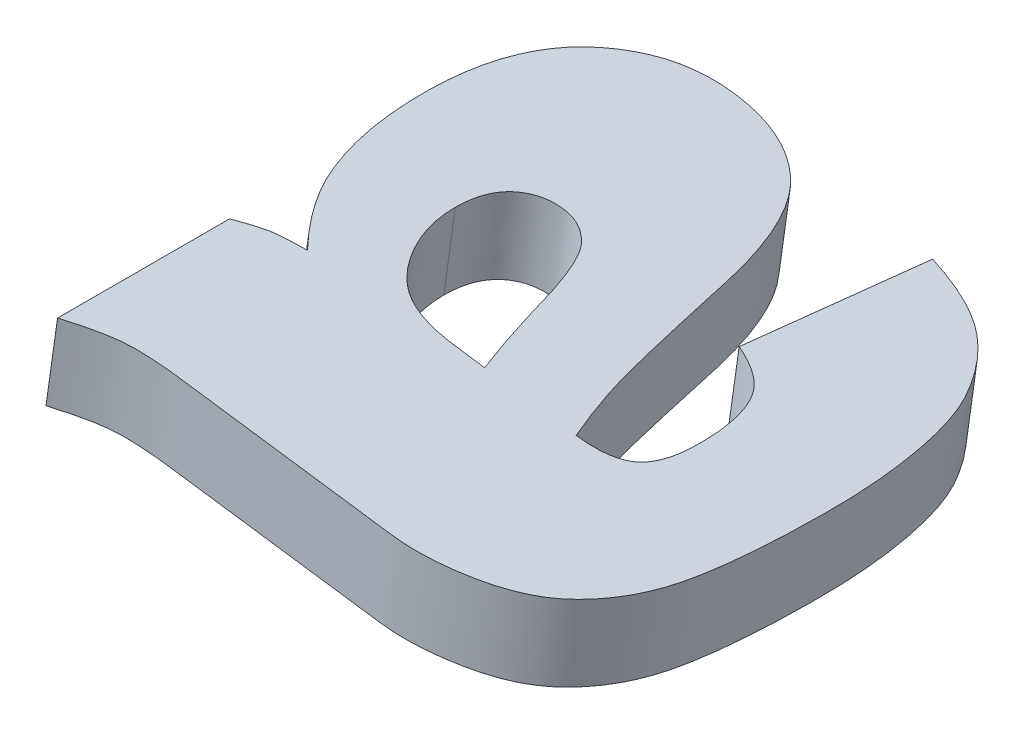
ISO-10303-21;
HEADER;
FILE_DESCRIPTION(('STEP AP214'),'2;1');
FILE_NAME('part.step','',(''),(''),'','','');
FILE_SCHEMA(('AUTOMOTIVE_DESIGN { 1 0 10303 214 1 1 1 1 }'));
ENDSEC;
DATA;
#1=APPLICATION_CONTEXT('core data for automotive mechanical design processes');
#2=APPLICATION_PROTOCOL_DEFINITION('international standard','automotive_design',2000,#1);
#3=PRODUCT_CONTEXT('',#1,'mechanical');
#4=PRODUCT('Part','Part','',(#3));
#5=PRODUCT_RELATED_PRODUCT_CATEGORY('part','',(#4));
#6=PRODUCT_DEFINITION_FORMATION('','',#4);
#7=PRODUCT_DEFINITION_CONTEXT('part definition',#1,'design');
#8=PRODUCT_DEFINITION('design','',#6,#7);
#9=PRODUCT_DEFINITION_SHAPE('','',#8);
#10=(LENGTH_UNIT() NAMED_UNIT(*) SI_UNIT(.MILLI.,.METRE.));
#11=(NAMED_UNIT(*) PLANE_ANGLE_UNIT() SI_UNIT($,.RADIAN.));
#12=(NAMED_UNIT(*) SI_UNIT($,.STERADIAN.) SOLID_ANGLE_UNIT());
#13=UNCERTAINTY_MEASURE_WITH_UNIT(LENGTH_MEASURE(1.E-05),#10,'distance_accuracy_value','');
#14=(GEOMETRIC_REPRESENTATION_CONTEXT(3) GLOBAL_UNCERTAINTY_ASSIGNED_CONTEXT((#13)) GLOBAL_UNIT_ASSIGNED_CONTEXT((#10,
#11,#12)) REPRESENTATION_CONTEXT('',''));
#15=CARTESIAN_POINT('',(0.,0.,0.));
#16=DIRECTION('',(0.,0.,1.));
#17=DIRECTION('',(1.,0.,0.));
#18=AXIS2_PLACEMENT_3D('',#15,#16,#17);
#19=CARTESIAN_POINT('',(815.430242035613,621.354833018957,1984.05582164703));
#20=CARTESIAN_POINT('',(815.430635431243,621.357632174306,1987.76659819662));
#21=CARTESIAN_POINT('',(817.214266978701,621.109414768777,1990.95895743414));
#22=CARTESIAN_POINT('',(818.99789852616,620.861197363247,1994.15131667166));
#23=CARTESIAN_POINT('',(821.564901561165,620.501457053226,1995.48828763438));
#24=CARTESIAN_POINT('',(824.131904596171,620.141716743205,1996.82525859711));
#25=CARTESIAN_POINT('',(828.23888267117,619.56451861644,1996.82525859711));
#26=CARTESIAN_POINT('',(829.995156190084,619.317690470126,1996.82525859711));
#27=CARTESIAN_POINT('',(831.751429708998,619.070862323812,1996.82525859711));
#28=B_SPLINE_CURVE_WITH_KNOTS('',2,(#19,#20,#21,#22,#23,#24,#25,#26,#27),.UNSPECIFIED.,.F.,.F.,
(3,2,2,2,3),(5.,6.,7.,8.,9.),.UNSPECIFIED.);
#29=DIRECTION('',(-0.139173060582166,-0.990267781437723,0.000761744447259926));
#30=VECTOR('',#29,1.);
#31=SURFACE_OF_LINEAR_EXTRUSION('',#28,#30);
#32=CARTESIAN_POINT('',(814.038511429792,611.45215520458,1984.0634390915));
#33=CARTESIAN_POINT('',(814.038904825421,611.454954359929,1987.77421564109));
#34=CARTESIAN_POINT('',(815.822536372879,611.2067369544,1990.96657487861));
#35=CARTESIAN_POINT('',(817.606167920338,610.95851954887,1994.15893411614));
#36=CARTESIAN_POINT('',(820.173170955344,610.598779238849,1995.49590507886));
#37=CARTESIAN_POINT('',(822.740173990349,610.239038928828,1996.83287604158));
#38=CARTESIAN_POINT('',(826.847152065348,609.661840802063,1996.83287604158));
#39=CARTESIAN_POINT('',(828.603425584262,609.415012655749,1996.83287604158));
#40=CARTESIAN_POINT('',(830.359699103177,609.168184509435,1996.83287604158));
#41=B_SPLINE_CURVE_WITH_KNOTS('',2,(#32,#33,#34,#35,#36,#37,#38,#39,#40),.UNSPECIFIED.,.F.,.F.,
(3,2,2,2,3),(5.,6.,7.,8.,9.),.UNSPECIFIED.);
#42=CARTESIAN_POINT('',(814.038511429792,611.45215520458,1984.0634390915));
#43=VERTEX_POINT('',#42);
#44=CARTESIAN_POINT('',(830.359699103177,609.168184509435,1996.83287604158));
#45=VERTEX_POINT('',#44);
#46=EDGE_CURVE('E115',#43,#45,#41,.T.);
#47=ORIENTED_EDGE('',*,*,#46,.F.);
#48=DIRECTION('',(-0.139173060582166,-0.990267781437723,0.000761744447259926));
#49=VECTOR('',#48,1.);
#50=CARTESIAN_POINT('',(815.430242035613,621.354833018957,1984.05582164703));
#51=LINE('',#50,#49);
#52=CARTESIAN_POINT('',(815.430242035613,621.354833018957,1984.05582164703));
#53=VERTEX_POINT('',#52);
#54=EDGE_CURVE('E27',#53,#43,#51,.T.);
#55=ORIENTED_EDGE('',*,*,#54,.F.);
#56=CARTESIAN_POINT('',(831.751429708998,619.070862323812,1996.82525859711));
#57=VERTEX_POINT('',#56);
#58=EDGE_CURVE('E104',#53,#57,#28,.T.);
#59=ORIENTED_EDGE('',*,*,#58,.T.);
#60=DIRECTION('',(-0.139173060582166,-0.990267781437723,0.000761744447259926));
#61=VECTOR('',#60,1.);
#62=CARTESIAN_POINT('',(831.751429708998,619.070862323812,1996.82525859711));
#63=LINE('',#62,#61);
#64=EDGE_CURVE('E11',#57,#45,#63,.T.);
#65=ORIENTED_EDGE('',*,*,#64,.T.);
#66=EDGE_LOOP('',(#47,#55,#59,#65));
#67=FACE_BOUND('',#66,.T.);
#68=ADVANCED_FACE('F17',(#67),#31,.T.);
#69=CARTESIAN_POINT('',(843.313773155098,617.431063004849,1977.56196268523));
#70=DIRECTION('',(-0.984824225523739,0.13832738958797,-0.104817832983448));
#71=DIRECTION('',(-0.103692352802707,0.0153380030052165,0.994491147086816));
#72=AXIS2_PLACEMENT_3D('',#69,#70,#71);
#73=PLANE('',#72);
#74=CARTESIAN_POINT('',(841.922042549277,607.528385190472,1977.56958012971));
#75=CARTESIAN_POINT('',(843.028720618618,607.364687182909,1966.95566779299));
#76=CARTESIAN_POINT('',(844.13539868796,607.200989175345,1956.34175545629));
#77=B_SPLINE_CURVE_WITH_KNOTS('',2,(#74,#75,#76),.UNSPECIFIED.,.F.,.F.,(3,3),(0.,1.),.UNSPECIFIED.);
#78=CARTESIAN_POINT('',(841.922042549277,607.528385190472,1977.56958012971));
#79=VERTEX_POINT('',#78);
#80=CARTESIAN_POINT('',(844.13539868796,607.200989175345,1956.34175545629));
#81=VERTEX_POINT('',#80);
#82=EDGE_CURVE('E91',#79,#81,#77,.T.);
#83=ORIENTED_EDGE('',*,*,#82,.F.);
#84=DIRECTION('',(-0.139173060582166,-0.990267781437723,0.000761744447259926));
#85=VECTOR('',#84,1.);
#86=CARTESIAN_POINT('',(843.313773155098,617.431063004849,1977.56196268523));
#87=LINE('',#86,#85);
#88=CARTESIAN_POINT('',(843.313773155098,617.431063004849,1977.56196268523));
#89=VERTEX_POINT('',#88);
#90=EDGE_CURVE('E86',#89,#79,#87,.T.);
#91=ORIENTED_EDGE('',*,*,#90,.F.);
#92=CARTESIAN_POINT('',(843.313773155098,617.431063004849,1977.56196268523));
#93=CARTESIAN_POINT('',(844.42045122444,617.267364997286,1966.94805034853));
#94=CARTESIAN_POINT('',(845.527129293781,617.103666989723,1956.33413801181));
#95=B_SPLINE_CURVE_WITH_KNOTS('',2,(#92,#93,#94),.UNSPECIFIED.,.F.,.F.,(3,3),(0.,1.),.UNSPECIFIED.);
#96=CARTESIAN_POINT('',(845.527129293781,617.103666989723,1956.33413801181));
#97=VERTEX_POINT('',#96);
#98=EDGE_CURVE('E89',#89,#97,#95,.T.);
#99=ORIENTED_EDGE('',*,*,#98,.T.);
#100=DIRECTION('',(-0.139173060582166,-0.990267781437723,0.000761744447259926));
#101=VECTOR('',#100,1.);
#102=CARTESIAN_POINT('',(845.527129293781,617.103666989723,1956.33413801181));
#103=LINE('',#102,#101);
#104=EDGE_CURVE('E21',#97,#81,#103,.T.);
#105=ORIENTED_EDGE('',*,*,#104,.T.);
#106=EDGE_LOOP('',(#83,#91,#99,#105));
#107=FACE_BOUND('',#106,.T.);
#108=ADVANCED_FACE('F19',(#107),#73,.T.);
#109=CARTESIAN_POINT('',(845.527129293781,617.103666989723,1956.33413801181));
#110=CARTESIAN_POINT('',(851.039253458968,616.32991195499,1957.53468336609));
#111=CARTESIAN_POINT('',(854.200785880052,615.887329599669,1959.79934846621));
#112=CARTESIAN_POINT('',(857.362318301136,615.444747244348,1962.06401356634));
#113=CARTESIAN_POINT('',(859.689544655393,615.120949798914,1966.31876918079));
#114=CARTESIAN_POINT('',(861.361993226539,614.888254524573,1969.37642617877));
#115=CARTESIAN_POINT('',(862.281226327419,614.763178494097,1974.72431002967));
#116=CARTESIAN_POINT('',(863.200459428298,614.638102463622,1980.07219388055));
#117=CARTESIAN_POINT('',(863.201118944501,614.642795165238,1986.29320162546));
#118=CARTESIAN_POINT('',(863.202177641562,614.650328186252,1996.27955616334));
#119=CARTESIAN_POINT('',(862.095016505528,614.810588995702,2002.33685317813));
#120=CARTESIAN_POINT('',(860.987855369495,614.970849805152,2008.3941501929));
#121=CARTESIAN_POINT('',(857.487906823487,615.465850053963,2012.44307655344));
#122=CARTESIAN_POINT('',(855.044273936746,615.811454816729,2015.27000085834));
#123=CARTESIAN_POINT('',(850.586214714859,616.439253494235,2016.90710815963));
#124=CARTESIAN_POINT('',(846.128155492972,617.06705217174,2018.54421546092));
#125=CARTESIAN_POINT('',(842.075216603171,617.636655586311,2018.54421546092));
#126=CARTESIAN_POINT('',(829.40302767439,619.417615595868,2018.54421546092));
#127=CARTESIAN_POINT('',(816.73083874561,621.198575605426,2018.54421546092));
#128=CARTESIAN_POINT('',(812.677899855808,621.768179019997,2018.54421546092));
#129=CARTESIAN_POINT('',(810.381289444604,622.091345346721,2019.06263277299));
#130=CARTESIAN_POINT('',(808.0846790334,622.414511673446,2019.58105008507));
#131=CARTESIAN_POINT('',(804.518277937729,622.917079927844,2021.32729787311));
#132=B_SPLINE_CURVE_WITH_KNOTS('',2,(#109,#110,#111,#112,#113,#114,#115,#116,#117,#118,#119,
#120,#121,#122,#123,#124,#125,#126,#127,#128,#129,#130,#131),.UNSPECIFIED.,.F.,.F.,(3,2,2,2,2,2,
2,2,2,2,2,3),(1.,2.,3.,4.,5.,6.,7.,8.,9.,10.,11.,12.),.UNSPECIFIED.);
#133=DIRECTION('',(-0.139173060582166,-0.990267781437723,0.000761744447259926));
#134=VECTOR('',#133,1.);
#135=SURFACE_OF_LINEAR_EXTRUSION('',#132,#134);
#136=CARTESIAN_POINT('',(844.13539868796,607.200989175345,1956.34175545629));
#137=CARTESIAN_POINT('',(849.647522853146,606.427234140613,1957.54230081057));
#138=CARTESIAN_POINT('',(852.80905527423,605.984651785292,1959.80696591069));
#139=CARTESIAN_POINT('',(855.970587695314,605.542069429971,1962.07163101081));
#140=CARTESIAN_POINT('',(858.297814049571,605.218271984537,1966.32638662527));
#141=CARTESIAN_POINT('',(859.970262620717,604.985576710196,1969.38404362325));
#142=CARTESIAN_POINT('',(860.889495721597,604.86050067972,1974.73192747414));
#143=CARTESIAN_POINT('',(861.808728822477,604.735424649245,1980.07981132502));
#144=CARTESIAN_POINT('',(861.809388338679,604.74011735086,1986.30081906993));
#145=CARTESIAN_POINT('',(861.81044703574,604.747650371875,1996.28717360782));
#146=CARTESIAN_POINT('',(860.703285899707,604.907911181325,2002.3444706226));
#147=CARTESIAN_POINT('',(859.596124763673,605.068171990775,2008.40176763738));
#148=CARTESIAN_POINT('',(856.096176217666,605.563172239585,2012.45069399791));
#149=CARTESIAN_POINT('',(853.652543330924,605.908777002352,2015.2776183028));
#150=CARTESIAN_POINT('',(849.194484109037,606.536575679858,2016.9147256041));
#151=CARTESIAN_POINT('',(844.736424887151,607.164374357363,2018.55183290539));
#152=CARTESIAN_POINT('',(840.683485997349,607.733977771934,2018.55183290539));
#153=CARTESIAN_POINT('',(828.011297068569,609.514937781491,2018.55183290539));
#154=CARTESIAN_POINT('',(815.339108139789,611.295897791049,2018.55183290539));
#155=CARTESIAN_POINT('',(811.286169249987,611.865501205619,2018.55183290539));
#156=CARTESIAN_POINT('',(808.989558838783,612.188667532344,2019.07025021747));
#157=CARTESIAN_POINT('',(806.692948427578,612.511833859069,2019.58866752954));
#158=CARTESIAN_POINT('',(803.126547331908,613.014402113467,2021.33491531759));
#159=B_SPLINE_CURVE_WITH_KNOTS('',2,(#136,#137,#138,#139,#140,#141,#142,#143,#144,#145,#146,
#147,#148,#149,#150,#151,#152,#153,#154,#155,#156,#157,#158),.UNSPECIFIED.,.F.,.F.,(3,2,2,2,2,2,
2,2,2,2,2,3),(1.,2.,3.,4.,5.,6.,7.,8.,9.,10.,11.,12.),.UNSPECIFIED.);
#160=CARTESIAN_POINT('',(803.126547331908,613.014402113467,2021.33491531759));
#161=VERTEX_POINT('',#160);
#162=EDGE_CURVE('E190',#81,#161,#159,.T.);
#163=ORIENTED_EDGE('',*,*,#162,.F.);
#164=ORIENTED_EDGE('',*,*,#104,.F.);
#165=CARTESIAN_POINT('',(804.518277937729,622.917079927844,2021.32729787311));
#166=VERTEX_POINT('',#165);
#167=EDGE_CURVE('E110',#97,#166,#132,.T.);
#168=ORIENTED_EDGE('',*,*,#167,.T.);
#169=DIRECTION('',(-0.139173060582166,-0.990267781437723,0.000761744447259926));
#170=VECTOR('',#169,1.);
#171=CARTESIAN_POINT('',(804.518277937729,622.917079927844,2021.32729787311));
#172=LINE('',#171,#170);
#173=EDGE_CURVE('E249',#166,#161,#172,.T.);
#174=ORIENTED_EDGE('',*,*,#173,.T.);
#175=EDGE_LOOP('',(#163,#164,#168,#174));
#176=FACE_BOUND('',#175,.T.);
#177=ADVANCED_FACE('F132',(#176),#135,.T.);
#178=CARTESIAN_POINT('',(804.518277937729,622.917079927844,2021.32729787311));
#179=DIRECTION('',(-0.990268068741567,0.139173100960088,0.));
#180=DIRECTION('',(0.000106014336860583,0.000754331202663224,0.999999709872657));
#181=AXIS2_PLACEMENT_3D('',#178,#179,#180);
#182=PLANE('',#181);
#183=CARTESIAN_POINT('',(803.126547331908,613.014402113467,2021.33491531759));
#184=CARTESIAN_POINT('',(803.125442353008,613.006539780059,2010.91199883269));
#185=CARTESIAN_POINT('',(803.124337374108,612.99867744665,2000.4890823478));
#186=B_SPLINE_CURVE_WITH_KNOTS('',2,(#183,#184,#185),.UNSPECIFIED.,.F.,.F.,(3,3),(12.,13.),.UNSPECIFIED.);
#187=CARTESIAN_POINT('',(803.124337374108,612.99867744665,2000.4890823478));
#188=VERTEX_POINT('',#187);
#189=EDGE_CURVE('E198',#161,#188,#186,.T.);
#190=ORIENTED_EDGE('',*,*,#189,.F.);
#191=ORIENTED_EDGE('',*,*,#173,.F.);
#192=CARTESIAN_POINT('',(804.518277937729,622.917079927844,2021.32729787311));
#193=CARTESIAN_POINT('',(804.51717295883,622.909217594436,2010.90438138822));
#194=CARTESIAN_POINT('',(804.51606797993,622.901355261027,2000.48146490332));
#195=B_SPLINE_CURVE_WITH_KNOTS('',2,(#192,#193,#194),.UNSPECIFIED.,.F.,.F.,(3,3),(12.,13.),.UNSPECIFIED.);
#196=CARTESIAN_POINT('',(804.51606797993,622.901355261027,2000.48146490332));
#197=VERTEX_POINT('',#196);
#198=EDGE_CURVE('E113',#166,#197,#195,.T.);
#199=ORIENTED_EDGE('',*,*,#198,.T.);
#200=DIRECTION('',(-0.139173060582166,-0.990267781437723,0.000761744447259926));
#201=VECTOR('',#200,1.);
#202=CARTESIAN_POINT('',(804.51606797993,622.901355261027,2000.48146490332));
#203=LINE('',#202,#201);
#204=EDGE_CURVE('E248',#197,#188,#203,.T.);
#205=ORIENTED_EDGE('',*,*,#204,.T.);
#206=EDGE_LOOP('',(#190,#191,#199,#205));
#207=FACE_BOUND('',#206,.T.);
#208=ADVANCED_FACE('F135',(#207),#182,.T.);
#209=CARTESIAN_POINT('',(804.51606797993,622.901355261027,2000.48146490332));
#210=CARTESIAN_POINT('',(806.731541512735,622.589025287929,1999.22634930567));
#211=CARTESIAN_POINT('',(807.893343497869,622.425450827407,1998.84435760204));
#212=CARTESIAN_POINT('',(809.055145483003,622.261876366886,1998.4623658984));
#213=CARTESIAN_POINT('',(811.540907505473,621.912231457604,1998.08037419476));
#214=B_SPLINE_CURVE_WITH_KNOTS('',2,(#209,#210,#211,#212,#213),.UNSPECIFIED.,.F.,.F.,(3,2,3),
(13.,14.,15.),.UNSPECIFIED.);
#215=DIRECTION('',(-0.139173060582166,-0.990267781437723,0.000761744447259926));
#216=VECTOR('',#215,1.);
#217=SURFACE_OF_LINEAR_EXTRUSION('',#214,#216);
#218=CARTESIAN_POINT('',(803.124337374108,612.99867744665,2000.4890823478));
#219=CARTESIAN_POINT('',(805.339810906913,612.686347473552,1999.23396675014));
#220=CARTESIAN_POINT('',(806.501612892048,612.52277301303,1998.85197504651));
#221=CARTESIAN_POINT('',(807.663414877182,612.359198552508,1998.46998334287));
#222=CARTESIAN_POINT('',(810.149176899651,612.009553643227,1998.08799163924));
#223=B_SPLINE_CURVE_WITH_KNOTS('',2,(#218,#219,#220,#221,#222),.UNSPECIFIED.,.F.,.F.,(3,2,3),
(13.,14.,15.),.UNSPECIFIED.);
#224=CARTESIAN_POINT('',(810.149176899651,612.009553643227,1998.08799163924));
#225=VERTEX_POINT('',#224);
#226=EDGE_CURVE('E206',#188,#225,#223,.T.);
#227=ORIENTED_EDGE('',*,*,#226,.F.);
#228=ORIENTED_EDGE('',*,*,#204,.F.);
#229=CARTESIAN_POINT('',(811.540907505473,621.912231457604,1998.08037419476));
#230=VERTEX_POINT('',#229);
#231=EDGE_CURVE('E146',#197,#230,#214,.T.);
#232=ORIENTED_EDGE('',*,*,#231,.T.);
#233=DIRECTION('',(-0.139173060582166,-0.990267781437723,0.000761744447259926));
#234=VECTOR('',#233,1.);
#235=CARTESIAN_POINT('',(811.540907505473,621.912231457604,1998.08037419476));
#236=LINE('',#235,#234);
#237=EDGE_CURVE('E246',#230,#225,#236,.T.);
#238=ORIENTED_EDGE('',*,*,#237,.T.);
#239=EDGE_LOOP('',(#227,#228,#232,#238));
#240=FACE_BOUND('',#239,.T.);
#241=ADVANCED_FACE('F138',(#240),#217,.T.);
#242=CARTESIAN_POINT('',(811.540907505473,621.912231457604,1998.08037419476));
#243=CARTESIAN_POINT('',(807.379427426889,622.493731172623,1993.71475472465));
#244=CARTESIAN_POINT('',(805.617419901195,622.738042034535,1989.39466427416));
#245=CARTESIAN_POINT('',(803.217328328712,623.070826334371,1983.51011921326));
#246=CARTESIAN_POINT('',(803.216501040845,623.064939875327,1975.70657441044));
#247=CARTESIAN_POINT('',(803.215401847174,623.057118705967,1965.33822816892));
#248=CARTESIAN_POINT('',(807.970280299402,622.384729374019,1959.96305919634));
#249=CARTESIAN_POINT('',(812.72515875163,621.712340042071,1954.58789022377));
#250=CARTESIAN_POINT('',(819.696213642089,620.73262216901,1954.58789022377));
#251=CARTESIAN_POINT('',(826.23495505097,619.813661993502,1954.58789022377));
#252=CARTESIAN_POINT('',(830.450422247682,619.224197089846,1958.46237750349));
#253=CARTESIAN_POINT('',(834.665889444395,618.63473218619,1962.33686478322));
#254=CARTESIAN_POINT('',(836.730875389285,618.352533351408,1972.7576824126));
#255=CARTESIAN_POINT('',(839.207610797507,618.01406526256,1985.25636700131));
#256=CARTESIAN_POINT('',(840.207729119287,617.876362242315,1988.96714355091));
#257=CARTESIAN_POINT('',(841.207847441068,617.738659222071,1992.6779201005));
#258=CARTESIAN_POINT('',(842.829462674456,617.513946323986,1996.82525859711));
#259=B_SPLINE_CURVE_WITH_KNOTS('',2,(#242,#243,#244,#245,#246,#247,#248,#249,#250,#251,#252,
#253,#254,#255,#256,#257,#258),.UNSPECIFIED.,.F.,.F.,(3,2,2,2,2,2,2,2,3),(15.,16.,17.,18.,19.,
20.,21.,22.,23.),.UNSPECIFIED.);
#260=DIRECTION('',(-0.139173060582166,-0.990267781437723,0.000761744447259926));
#261=VECTOR('',#260,1.);
#262=SURFACE_OF_LINEAR_EXTRUSION('',#259,#261);
#263=CARTESIAN_POINT('',(810.149176899651,612.009553643227,1998.08799163924));
#264=CARTESIAN_POINT('',(805.987696821067,612.591053358245,1993.72237216912));
#265=CARTESIAN_POINT('',(804.225689295374,612.835364220158,1989.40228171863));
#266=CARTESIAN_POINT('',(801.82559772289,613.168148519993,1983.51773665773));
#267=CARTESIAN_POINT('',(801.824770435023,613.162262060949,1975.71419185491));
#268=CARTESIAN_POINT('',(801.823671241353,613.15444089159,1965.34584561339));
#269=CARTESIAN_POINT('',(806.578549693581,612.482051559642,1959.97067664081));
#270=CARTESIAN_POINT('',(811.333428145809,611.809662227694,1954.59550766824));
#271=CARTESIAN_POINT('',(818.304483036268,610.829944354632,1954.59550766824));
#272=CARTESIAN_POINT('',(824.843224445148,609.910984179125,1954.59550766824));
#273=CARTESIAN_POINT('',(829.058691641861,609.321519275469,1958.46999494797));
#274=CARTESIAN_POINT('',(833.274158838573,608.732054371813,1962.34448222769));
#275=CARTESIAN_POINT('',(835.339144783463,608.44985553703,1972.76529985707));
#276=CARTESIAN_POINT('',(837.815880191685,608.111387448182,1985.26398444578));
#277=CARTESIAN_POINT('',(838.815998513466,607.973684427938,1988.97476099538));
#278=CARTESIAN_POINT('',(839.816116835246,607.835981407694,1992.68553754497));
#279=CARTESIAN_POINT('',(841.437732068635,607.611268509609,1996.83287604158));
#280=B_SPLINE_CURVE_WITH_KNOTS('',2,(#263,#264,#265,#266,#267,#268,#269,#270,#271,#272,#273,
#274,#275,#276,#277,#278,#279),.UNSPECIFIED.,.F.,.F.,(3,2,2,2,2,2,2,2,3),(15.,16.,17.,18.,19.,
20.,21.,22.,23.),.UNSPECIFIED.);
#281=CARTESIAN_POINT('',(841.437732068635,607.611268509609,1996.83287604158));
#282=VERTEX_POINT('',#281);
#283=EDGE_CURVE('E214',#225,#282,#280,.T.);
#284=ORIENTED_EDGE('',*,*,#283,.F.);
#285=ORIENTED_EDGE('',*,*,#237,.F.);
#286=CARTESIAN_POINT('',(842.829462674456,617.513946323986,1996.82525859711));
#287=VERTEX_POINT('',#286);
#288=EDGE_CURVE('E105',#230,#287,#259,.T.);
#289=ORIENTED_EDGE('',*,*,#288,.T.);
#290=DIRECTION('',(-0.139173060582166,-0.990267781437723,0.000761744447259926));
#291=VECTOR('',#290,1.);
#292=CARTESIAN_POINT('',(842.829462674456,617.513946323986,1996.82525859711));
#293=LINE('',#292,#291);
#294=EDGE_CURVE('E95',#287,#282,#293,.T.);
#295=ORIENTED_EDGE('',*,*,#294,.T.);
#296=EDGE_LOOP('',(#284,#285,#289,#295));
#297=FACE_BOUND('',#296,.T.);
#298=ADVANCED_FACE('F142',(#297),#262,.T.);
#299=CARTESIAN_POINT('',(842.829462674456,617.513946323986,1996.82525859711));
#300=CARTESIAN_POINT('',(846.882401564258,616.944342909416,1996.82525859711));
#301=CARTESIAN_POINT('',(848.503397778054,616.71522545806,1995.13358105244));
#302=CARTESIAN_POINT('',(850.124393991849,616.486108006705,1993.44190350777));
#303=CARTESIAN_POINT('',(850.123942743922,616.482897210863,1989.18542452441));
#304=CARTESIAN_POINT('',(850.123364220938,616.478780805937,1983.72840018677));
#305=CARTESIAN_POINT('',(848.392959948488,616.71987483966,1981.00044495687));
#306=CARTESIAN_POINT('',(847.042615779232,616.908015800626,1978.87164852627));
#307=CARTESIAN_POINT('',(843.313773155098,617.431063004849,1977.56196268523));
#308=B_SPLINE_CURVE_WITH_KNOTS('',2,(#299,#300,#301,#302,#303,#304,#305,#306,#307),
.UNSPECIFIED.,.F.,.F.,(3,2,2,2,3),(23.,24.,25.,26.,27.),.UNSPECIFIED.);
#309=DIRECTION('',(-0.139173060582166,-0.990267781437723,0.000761744447259926));
#310=VECTOR('',#309,1.);
#311=SURFACE_OF_LINEAR_EXTRUSION('',#308,#310);
#312=CARTESIAN_POINT('',(841.437732068635,607.611268509609,1996.83287604158));
#313=CARTESIAN_POINT('',(845.490670958436,607.041665095038,1996.83287604158));
#314=CARTESIAN_POINT('',(847.111667172232,606.812547643683,1995.14119849691));
#315=CARTESIAN_POINT('',(848.732663386028,606.583430192328,1993.44952095224));
#316=CARTESIAN_POINT('',(848.7322121381,606.580219396485,1989.19304196888));
#317=CARTESIAN_POINT('',(848.731633615116,606.57610299156,1983.73601763124));
#318=CARTESIAN_POINT('',(847.001229342666,606.817197025282,1981.00806240134));
#319=CARTESIAN_POINT('',(845.650885173411,607.005337986249,1978.87926597074));
#320=CARTESIAN_POINT('',(841.922042549277,607.528385190472,1977.56958012971));
#321=B_SPLINE_CURVE_WITH_KNOTS('',2,(#312,#313,#314,#315,#316,#317,#318,#319,#320),
.UNSPECIFIED.,.F.,.F.,(3,2,2,2,3),(23.,24.,25.,26.,27.),.UNSPECIFIED.);
#322=EDGE_CURVE('E222',#282,#79,#321,.T.);
#323=ORIENTED_EDGE('',*,*,#322,.F.);
#324=ORIENTED_EDGE('',*,*,#294,.F.);
#325=EDGE_CURVE('E99',#287,#89,#308,.T.);
#326=ORIENTED_EDGE('',*,*,#325,.T.);
#327=ORIENTED_EDGE('',*,*,#90,.T.);
#328=EDGE_LOOP('',(#323,#324,#326,#327));
#329=FACE_BOUND('',#328,.T.);
#330=ADVANCED_FACE('F100',(#329),#311,.T.);
#331=CARTESIAN_POINT('',(831.751429708998,619.070862323812,1996.82525859711));
#332=CARTESIAN_POINT('',(830.129768193771,619.295245909503,1992.24135815349));
#333=CARTESIAN_POINT('',(828.850799601358,619.471180497073,1987.28481439824));
#334=CARTESIAN_POINT('',(827.102329998303,619.711699521792,1980.50875582756));
#335=CARTESIAN_POINT('',(825.372469707329,619.953430599483,1978.70834484983));
#336=CARTESIAN_POINT('',(823.589395350075,620.202597823119,1976.85254952134));
#337=CARTESIAN_POINT('',(821.319749571786,620.521575735279,1976.85254952134));
#338=CARTESIAN_POINT('',(818.725868682313,620.886121920604,1976.85254952134));
#339=CARTESIAN_POINT('',(817.077867338993,621.11913963818,1978.68065267445));
#340=CARTESIAN_POINT('',(815.429865995673,621.352157355755,1980.50875582756));
#341=CARTESIAN_POINT('',(815.430242035613,621.354833018957,1984.05582164703));
#342=B_SPLINE_CURVE_WITH_KNOTS('',2,(#331,#332,#333,#334,#335,#336,#337,#338,#339,#340,#341),
.UNSPECIFIED.,.F.,.F.,(3,2,2,2,2,3),(0.,1.,2.,3.,4.,5.),.UNSPECIFIED.);
#343=DIRECTION('',(-0.139173060582166,-0.990267781437723,0.000761744447259926));
#344=VECTOR('',#343,1.);
#345=SURFACE_OF_LINEAR_EXTRUSION('',#342,#344);
#346=CARTESIAN_POINT('',(830.359699103177,609.168184509435,1996.83287604158));
#347=CARTESIAN_POINT('',(828.738037587949,609.392568095126,1992.24897559796));
#348=CARTESIAN_POINT('',(827.459068995536,609.568502682696,1987.29243184272));
#349=CARTESIAN_POINT('',(825.710599392481,609.809021707415,1980.51637327204));
#350=CARTESIAN_POINT('',(823.980739101507,610.050752785105,1978.7159622943));
#351=CARTESIAN_POINT('',(822.197664744253,610.299920008742,1976.86016696582));
#352=CARTESIAN_POINT('',(819.928018965964,610.618897920902,1976.86016696582));
#353=CARTESIAN_POINT('',(817.334138076491,610.983444106227,1976.86016696582));
#354=CARTESIAN_POINT('',(815.686136733172,611.216461823802,1978.68827011892));
#355=CARTESIAN_POINT('',(814.038135389852,611.449479541378,1980.51637327204));
#356=CARTESIAN_POINT('',(814.038511429792,611.45215520458,1984.0634390915));
#357=B_SPLINE_CURVE_WITH_KNOTS('',2,(#346,#347,#348,#349,#350,#351,#352,#353,#354,#355,#356),
.UNSPECIFIED.,.F.,.F.,(3,2,2,2,2,3),(0.,1.,2.,3.,4.,5.),.UNSPECIFIED.);
#358=EDGE_CURVE('E111',#45,#43,#357,.T.);
#359=ORIENTED_EDGE('',*,*,#358,.F.);
#360=ORIENTED_EDGE('',*,*,#64,.F.);
#361=EDGE_CURVE('E96',#57,#53,#342,.T.);
#362=ORIENTED_EDGE('',*,*,#361,.T.);
#363=ORIENTED_EDGE('',*,*,#54,.T.);
#364=EDGE_LOOP('',(#359,#360,#362,#363));
#365=FACE_BOUND('',#364,.T.);
#366=ADVANCED_FACE('F173',(#365),#345,.T.);
#367=CARTESIAN_POINT('',(860.389658517001,615.054534664992,2007.89205752934));
#368=DIRECTION('',(0.139173060582179,0.990267781437721,-0.000761744447229885));
#369=DIRECTION('',(0.28642082499884,-0.0409901500375351,-0.957226680889582));
#370=AXIS2_PLACEMENT_3D('',#367,#368,#369);
#371=PLANE('',#370);
#372=ORIENTED_EDGE('',*,*,#98,.F.);
#373=ORIENTED_EDGE('',*,*,#325,.F.);
#374=ORIENTED_EDGE('',*,*,#288,.F.);
#375=ORIENTED_EDGE('',*,*,#231,.F.);
#376=ORIENTED_EDGE('',*,*,#198,.F.);
#377=ORIENTED_EDGE('',*,*,#167,.F.);
#378=EDGE_LOOP('',(#372,#373,#374,#375,#376,#377));
#379=FACE_BOUND('',#378,.T.);
#380=ORIENTED_EDGE('',*,*,#58,.F.);
#381=ORIENTED_EDGE('',*,*,#361,.F.);
#382=EDGE_LOOP('',(#380,#381));
#383=FACE_BOUND('',#382,.T.);
#384=ADVANCED_FACE('F107',(#379,#383),#371,.T.);
#385=CARTESIAN_POINT('',(858.99792791118,605.151856850615,2007.89967497381));
#386=DIRECTION('',(0.139173060582179,0.990267781437721,-0.000761744447229885));
#387=DIRECTION('',(0.28642082499884,-0.0409901500375351,-0.957226680889582));
#388=AXIS2_PLACEMENT_3D('',#385,#386,#387);
#389=PLANE('',#388);
#390=ORIENTED_EDGE('',*,*,#82,.T.);
#391=ORIENTED_EDGE('',*,*,#162,.T.);
#392=ORIENTED_EDGE('',*,*,#189,.T.);
#393=ORIENTED_EDGE('',*,*,#226,.T.);
#394=ORIENTED_EDGE('',*,*,#283,.T.);
#395=ORIENTED_EDGE('',*,*,#322,.T.);
#396=EDGE_LOOP('',(#390,#391,#392,#393,#394,#395));
#397=FACE_BOUND('',#396,.T.);
#398=ORIENTED_EDGE('',*,*,#46,.T.);
#399=ORIENTED_EDGE('',*,*,#358,.T.);
#400=EDGE_LOOP('',(#398,#399));
#401=FACE_BOUND('',#400,.T.);
#402=ADVANCED_FACE('F178',(#397,#401),#389,.F.);
#403=CLOSED_SHELL('',(#68,#108,#177,#208,#241,#298,#330,#366,#384,#402));
#404=MANIFOLD_SOLID_BREP('B1',#403);
#405=ADVANCED_BREP_SHAPE_REPRESENTATION('',(#18,#404),#14);
#406=SHAPE_DEFINITION_REPRESENTATION(#9,#405);
ENDSEC;
END-ISO-10303-21;
